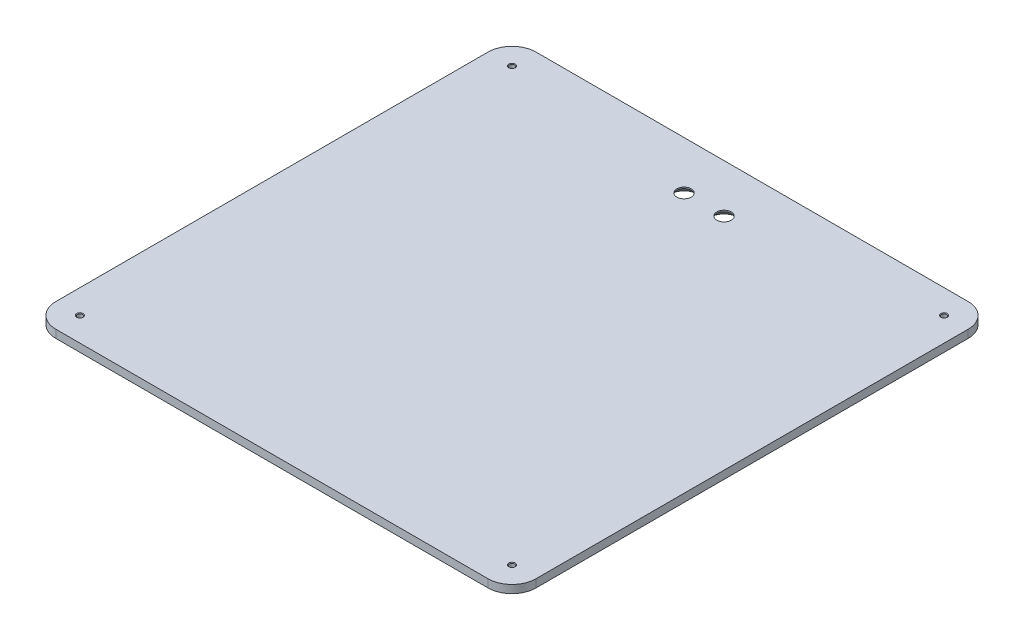
ISO-10303-21;
HEADER;
FILE_DESCRIPTION(('STEP AP214'),'2;1');
FILE_NAME('part.step','',(''),(''),'','','');
FILE_SCHEMA(('AUTOMOTIVE_DESIGN { 1 0 10303 214 1 1 1 1 }'));
ENDSEC;
DATA;
#1=APPLICATION_CONTEXT('core data for automotive mechanical design processes');
#2=APPLICATION_PROTOCOL_DEFINITION('international standard','automotive_design',2000,#1);
#3=PRODUCT_CONTEXT('',#1,'mechanical');
#4=PRODUCT('Part','Part','',(#3));
#5=PRODUCT_RELATED_PRODUCT_CATEGORY('part','',(#4));
#6=PRODUCT_DEFINITION_FORMATION('','',#4);
#7=PRODUCT_DEFINITION_CONTEXT('part definition',#1,'design');
#8=PRODUCT_DEFINITION('design','',#6,#7);
#9=PRODUCT_DEFINITION_SHAPE('','',#8);
#10=(LENGTH_UNIT() NAMED_UNIT(*) SI_UNIT(.MILLI.,.METRE.));
#11=(NAMED_UNIT(*) PLANE_ANGLE_UNIT() SI_UNIT($,.RADIAN.));
#12=(NAMED_UNIT(*) SI_UNIT($,.STERADIAN.) SOLID_ANGLE_UNIT());
#13=UNCERTAINTY_MEASURE_WITH_UNIT(LENGTH_MEASURE(1.E-05),#10,'distance_accuracy_value','');
#14=(GEOMETRIC_REPRESENTATION_CONTEXT(3) GLOBAL_UNCERTAINTY_ASSIGNED_CONTEXT((#13)) GLOBAL_UNIT_ASSIGNED_CONTEXT((#10,
#11,#12)) REPRESENTATION_CONTEXT('',''));
#15=CARTESIAN_POINT('',(0.,0.,0.));
#16=DIRECTION('',(0.,0.,1.));
#17=DIRECTION('',(1.,0.,0.));
#18=AXIS2_PLACEMENT_3D('',#15,#16,#17);
#19=CARTESIAN_POINT('',(-150.,-5.,-150.));
#20=DIRECTION('',(-1.,0.,0.));
#21=DIRECTION('',(0.,0.,1.));
#22=AXIS2_PLACEMENT_3D('',#19,#20,#21);
#23=PLANE('',#22);
#24=DIRECTION('',(0.,0.,1.));
#25=VECTOR('',#24,1.);
#26=CARTESIAN_POINT('',(-150.,-5.,-150.));
#27=LINE('',#26,#25);
#28=CARTESIAN_POINT('',(-150.,-5.,-135.));
#29=VERTEX_POINT('',#28);
#30=CARTESIAN_POINT('',(-150.,-5.,135.));
#31=VERTEX_POINT('',#30);
#32=EDGE_CURVE('E158',#29,#31,#27,.T.);
#33=ORIENTED_EDGE('',*,*,#32,.T.);
#34=DIRECTION('',(0.,1.,0.));
#35=VECTOR('',#34,1.);
#36=CARTESIAN_POINT('',(-150.,-5.,135.));
#37=LINE('',#36,#35);
#38=CARTESIAN_POINT('',(-150.,0.,135.));
#39=VERTEX_POINT('',#38);
#40=EDGE_CURVE('E11',#31,#39,#37,.T.);
#41=ORIENTED_EDGE('',*,*,#40,.T.);
#42=DIRECTION('',(0.,0.,1.));
#43=VECTOR('',#42,1.);
#44=CARTESIAN_POINT('',(-150.,0.,-150.));
#45=LINE('',#44,#43);
#46=CARTESIAN_POINT('',(-150.,0.,-135.));
#47=VERTEX_POINT('',#46);
#48=EDGE_CURVE('E161',#47,#39,#45,.T.);
#49=ORIENTED_EDGE('',*,*,#48,.F.);
#50=DIRECTION('',(0.,1.,0.));
#51=VECTOR('',#50,1.);
#52=CARTESIAN_POINT('',(-150.,-5.,-135.));
#53=LINE('',#52,#51);
#54=EDGE_CURVE('E46',#47,#29,#53,.F.);
#55=ORIENTED_EDGE('',*,*,#54,.T.);
#56=EDGE_LOOP('',(#33,#41,#49,#55));
#57=FACE_BOUND('',#56,.T.);
#58=ADVANCED_FACE('F38',(#57),#23,.T.);
#59=CARTESIAN_POINT('',(150.,-5.,-150.));
#60=DIRECTION('',(0.,0.,-1.));
#61=DIRECTION('',(-1.,0.,0.));
#62=AXIS2_PLACEMENT_3D('',#59,#60,#61);
#63=PLANE('',#62);
#64=DIRECTION('',(-1.,0.,0.));
#65=VECTOR('',#64,1.);
#66=CARTESIAN_POINT('',(150.,0.,-150.));
#67=LINE('',#66,#65);
#68=CARTESIAN_POINT('',(135.,0.,-150.));
#69=VERTEX_POINT('',#68);
#70=CARTESIAN_POINT('',(-135.,0.,-150.));
#71=VERTEX_POINT('',#70);
#72=EDGE_CURVE('E124',#69,#71,#67,.T.);
#73=ORIENTED_EDGE('',*,*,#72,.F.);
#74=DIRECTION('',(0.,1.,0.));
#75=VECTOR('',#74,1.);
#76=CARTESIAN_POINT('',(135.,-5.,-150.));
#77=LINE('',#76,#75);
#78=CARTESIAN_POINT('',(135.,-5.,-150.));
#79=VERTEX_POINT('',#78);
#80=EDGE_CURVE('E142',#69,#79,#77,.F.);
#81=ORIENTED_EDGE('',*,*,#80,.T.);
#82=DIRECTION('',(-1.,0.,0.));
#83=VECTOR('',#82,1.);
#84=CARTESIAN_POINT('',(150.,-5.,-150.));
#85=LINE('',#84,#83);
#86=CARTESIAN_POINT('',(-135.,-5.,-150.));
#87=VERTEX_POINT('',#86);
#88=EDGE_CURVE('E127',#79,#87,#85,.T.);
#89=ORIENTED_EDGE('',*,*,#88,.T.);
#90=DIRECTION('',(0.,1.,0.));
#91=VECTOR('',#90,1.);
#92=CARTESIAN_POINT('',(-135.,-5.,-150.));
#93=LINE('',#92,#91);
#94=EDGE_CURVE('E139',#87,#71,#93,.T.);
#95=ORIENTED_EDGE('',*,*,#94,.T.);
#96=EDGE_LOOP('',(#73,#81,#89,#95));
#97=FACE_BOUND('',#96,.T.);
#98=ADVANCED_FACE('F173',(#97),#63,.T.);
#99=CARTESIAN_POINT('',(150.,-5.,-150.));
#100=DIRECTION('',(1.,0.,0.));
#101=DIRECTION('',(0.,0.,-1.));
#102=AXIS2_PLACEMENT_3D('',#99,#100,#101);
#103=PLANE('',#102);
#104=DIRECTION('',(0.,0.,-1.));
#105=VECTOR('',#104,1.);
#106=CARTESIAN_POINT('',(150.,-5.,-150.));
#107=LINE('',#106,#105);
#108=CARTESIAN_POINT('',(150.,-5.,135.));
#109=VERTEX_POINT('',#108);
#110=CARTESIAN_POINT('',(150.,-5.,-135.));
#111=VERTEX_POINT('',#110);
#112=EDGE_CURVE('E132',#109,#111,#107,.T.);
#113=ORIENTED_EDGE('',*,*,#112,.T.);
#114=DIRECTION('',(0.,1.,0.));
#115=VECTOR('',#114,1.);
#116=CARTESIAN_POINT('',(150.,-5.,-135.));
#117=LINE('',#116,#115);
#118=CARTESIAN_POINT('',(150.,0.,-135.));
#119=VERTEX_POINT('',#118);
#120=EDGE_CURVE('E123',#111,#119,#117,.T.);
#121=ORIENTED_EDGE('',*,*,#120,.T.);
#122=DIRECTION('',(0.,0.,-1.));
#123=VECTOR('',#122,1.);
#124=CARTESIAN_POINT('',(150.,0.,-150.));
#125=LINE('',#124,#123);
#126=CARTESIAN_POINT('',(150.,0.,135.));
#127=VERTEX_POINT('',#126);
#128=EDGE_CURVE('E108',#127,#119,#125,.T.);
#129=ORIENTED_EDGE('',*,*,#128,.F.);
#130=DIRECTION('',(0.,1.,0.));
#131=VECTOR('',#130,1.);
#132=CARTESIAN_POINT('',(150.,-5.,135.));
#133=LINE('',#132,#131);
#134=EDGE_CURVE('E121',#127,#109,#133,.F.);
#135=ORIENTED_EDGE('',*,*,#134,.T.);
#136=EDGE_LOOP('',(#113,#121,#129,#135));
#137=FACE_BOUND('',#136,.T.);
#138=ADVANCED_FACE('F120',(#137),#103,.T.);
#139=CARTESIAN_POINT('',(150.,-5.,150.));
#140=DIRECTION('',(0.,0.,1.));
#141=DIRECTION('',(1.,0.,0.));
#142=AXIS2_PLACEMENT_3D('',#139,#140,#141);
#143=PLANE('',#142);
#144=DIRECTION('',(1.,0.,0.));
#145=VECTOR('',#144,1.);
#146=CARTESIAN_POINT('',(150.,-5.,150.));
#147=LINE('',#146,#145);
#148=CARTESIAN_POINT('',(-135.,-5.,150.));
#149=VERTEX_POINT('',#148);
#150=CARTESIAN_POINT('',(135.,-5.,150.));
#151=VERTEX_POINT('',#150);
#152=EDGE_CURVE('E167',#149,#151,#147,.T.);
#153=ORIENTED_EDGE('',*,*,#152,.T.);
#154=DIRECTION('',(0.,1.,0.));
#155=VECTOR('',#154,1.);
#156=CARTESIAN_POINT('',(135.,-5.,150.));
#157=LINE('',#156,#155);
#158=CARTESIAN_POINT('',(135.,0.,150.));
#159=VERTEX_POINT('',#158);
#160=EDGE_CURVE('E152',#151,#159,#157,.T.);
#161=ORIENTED_EDGE('',*,*,#160,.T.);
#162=DIRECTION('',(1.,0.,0.));
#163=VECTOR('',#162,1.);
#164=CARTESIAN_POINT('',(150.,0.,150.));
#165=LINE('',#164,#163);
#166=CARTESIAN_POINT('',(-135.,0.,150.));
#167=VERTEX_POINT('',#166);
#168=EDGE_CURVE('E109',#167,#159,#165,.T.);
#169=ORIENTED_EDGE('',*,*,#168,.F.);
#170=DIRECTION('',(0.,1.,0.));
#171=VECTOR('',#170,1.);
#172=CARTESIAN_POINT('',(-135.,-5.,150.));
#173=LINE('',#172,#171);
#174=EDGE_CURVE('E60',#167,#149,#173,.F.);
#175=ORIENTED_EDGE('',*,*,#174,.T.);
#176=EDGE_LOOP('',(#153,#161,#169,#175));
#177=FACE_BOUND('',#176,.T.);
#178=ADVANCED_FACE('F270',(#177),#143,.T.);
#179=CARTESIAN_POINT('',(0.,-5.,0.));
#180=DIRECTION('',(0.,-1.,0.));
#181=DIRECTION('',(0.,0.,-1.));
#182=AXIS2_PLACEMENT_3D('',#179,#180,#181);
#183=PLANE('',#182);
#184=CARTESIAN_POINT('',(135.,-5.,135.));
#185=DIRECTION('',(0.,-1.,0.));
#186=DIRECTION('',(0.,0.,-1.));
#187=AXIS2_PLACEMENT_3D('',#184,#185,#186);
#188=CIRCLE('',#187,1.65);
#189=CARTESIAN_POINT('',(135.,-5.,133.35));
#190=VERTEX_POINT('',#189);
#191=EDGE_CURVE('E230',#190,#190,#188,.T.);
#192=ORIENTED_EDGE('',*,*,#191,.F.);
#193=EDGE_LOOP('',(#192));
#194=FACE_BOUND('',#193,.T.);
#195=CARTESIAN_POINT('',(-135.,-5.,135.));
#196=DIRECTION('',(0.,-1.,0.));
#197=DIRECTION('',(0.,0.,-1.));
#198=AXIS2_PLACEMENT_3D('',#195,#196,#197);
#199=CIRCLE('',#198,1.65000000000001);
#200=CARTESIAN_POINT('',(-135.,-5.,133.35));
#201=VERTEX_POINT('',#200);
#202=EDGE_CURVE('E221',#201,#201,#199,.T.);
#203=ORIENTED_EDGE('',*,*,#202,.F.);
#204=EDGE_LOOP('',(#203));
#205=FACE_BOUND('',#204,.T.);
#206=CARTESIAN_POINT('',(-135.,-5.,-135.));
#207=DIRECTION('',(0.,-1.,0.));
#208=DIRECTION('',(0.,0.,-1.));
#209=AXIS2_PLACEMENT_3D('',#206,#207,#208);
#210=CIRCLE('',#209,1.65000000000001);
#211=CARTESIAN_POINT('',(-135.,-5.,-136.65));
#212=VERTEX_POINT('',#211);
#213=EDGE_CURVE('E212',#212,#212,#210,.T.);
#214=ORIENTED_EDGE('',*,*,#213,.F.);
#215=EDGE_LOOP('',(#214));
#216=FACE_BOUND('',#215,.T.);
#217=CARTESIAN_POINT('',(135.,-5.,-135.));
#218=DIRECTION('',(0.,-1.,0.));
#219=DIRECTION('',(0.,0.,-1.));
#220=AXIS2_PLACEMENT_3D('',#217,#218,#219);
#221=CIRCLE('',#220,1.65);
#222=CARTESIAN_POINT('',(135.,-5.,-136.65));
#223=VERTEX_POINT('',#222);
#224=EDGE_CURVE('E203',#223,#223,#221,.T.);
#225=ORIENTED_EDGE('',*,*,#224,.F.);
#226=EDGE_LOOP('',(#225));
#227=FACE_BOUND('',#226,.T.);
#228=CARTESIAN_POINT('',(12.5,-5.,-120.));
#229=DIRECTION('',(0.,-1.,0.));
#230=DIRECTION('',(0.,0.,-1.));
#231=AXIS2_PLACEMENT_3D('',#228,#229,#230);
#232=CIRCLE('',#231,8.65);
#233=CARTESIAN_POINT('',(12.5,-5.,-128.65));
#234=VERTEX_POINT('',#233);
#235=EDGE_CURVE('E200',#234,#234,#232,.T.);
#236=ORIENTED_EDGE('',*,*,#235,.F.);
#237=EDGE_LOOP('',(#236));
#238=FACE_BOUND('',#237,.T.);
#239=CARTESIAN_POINT('',(-12.5,-5.,-120.));
#240=DIRECTION('',(0.,-1.,0.));
#241=DIRECTION('',(0.,0.,-1.));
#242=AXIS2_PLACEMENT_3D('',#239,#240,#241);
#243=CIRCLE('',#242,8.65);
#244=CARTESIAN_POINT('',(-12.5,-5.,-128.65));
#245=VERTEX_POINT('',#244);
#246=EDGE_CURVE('E189',#245,#245,#243,.T.);
#247=ORIENTED_EDGE('',*,*,#246,.F.);
#248=EDGE_LOOP('',(#247));
#249=FACE_BOUND('',#248,.T.);
#250=ORIENTED_EDGE('',*,*,#88,.F.);
#251=CARTESIAN_POINT('',(135.,-5.,-135.));
#252=DIRECTION('',(0.,-1.,0.));
#253=DIRECTION('',(0.,0.,-1.));
#254=AXIS2_PLACEMENT_3D('',#251,#252,#253);
#255=CIRCLE('',#254,15.);
#256=EDGE_CURVE('E149',#79,#111,#255,.T.);
#257=ORIENTED_EDGE('',*,*,#256,.T.);
#258=ORIENTED_EDGE('',*,*,#112,.F.);
#259=CARTESIAN_POINT('',(135.,-5.,135.));
#260=DIRECTION('',(0.,-1.,0.));
#261=DIRECTION('',(0.,0.,-1.));
#262=AXIS2_PLACEMENT_3D('',#259,#260,#261);
#263=CIRCLE('',#262,15.);
#264=EDGE_CURVE('E53',#109,#151,#263,.T.);
#265=ORIENTED_EDGE('',*,*,#264,.T.);
#266=ORIENTED_EDGE('',*,*,#152,.F.);
#267=CARTESIAN_POINT('',(-135.,-5.,135.));
#268=DIRECTION('',(0.,-1.,0.));
#269=DIRECTION('',(0.,0.,-1.));
#270=AXIS2_PLACEMENT_3D('',#267,#268,#269);
#271=CIRCLE('',#270,15.);
#272=EDGE_CURVE('E146',#149,#31,#271,.T.);
#273=ORIENTED_EDGE('',*,*,#272,.T.);
#274=ORIENTED_EDGE('',*,*,#32,.F.);
#275=CARTESIAN_POINT('',(-135.,-5.,-135.));
#276=DIRECTION('',(0.,-1.,0.));
#277=DIRECTION('',(0.,0.,-1.));
#278=AXIS2_PLACEMENT_3D('',#275,#276,#277);
#279=CIRCLE('',#278,15.);
#280=EDGE_CURVE('E144',#29,#87,#279,.T.);
#281=ORIENTED_EDGE('',*,*,#280,.T.);
#282=EDGE_LOOP('',(#250,#257,#258,#265,#266,#273,#274,#281));
#283=FACE_BOUND('',#282,.T.);
#284=ADVANCED_FACE('F165',(#194,#205,#216,#227,#238,#249,#283),#183,.T.);
#285=CARTESIAN_POINT('',(0.,0.,0.));
#286=DIRECTION('',(0.,-1.,0.));
#287=DIRECTION('',(0.,0.,-1.));
#288=AXIS2_PLACEMENT_3D('',#285,#286,#287);
#289=PLANE('',#288);
#290=CARTESIAN_POINT('',(135.,0.,135.));
#291=DIRECTION('',(0.,1.,0.));
#292=DIRECTION('',(0.,0.,1.));
#293=AXIS2_PLACEMENT_3D('',#290,#291,#292);
#294=CIRCLE('',#293,2.025);
#295=CARTESIAN_POINT('',(135.,0.,137.025));
#296=VERTEX_POINT('',#295);
#297=EDGE_CURVE('E236',#296,#296,#294,.T.);
#298=ORIENTED_EDGE('',*,*,#297,.F.);
#299=EDGE_LOOP('',(#298));
#300=FACE_BOUND('',#299,.T.);
#301=CARTESIAN_POINT('',(-135.,0.,135.));
#302=DIRECTION('',(0.,1.,0.));
#303=DIRECTION('',(0.,0.,1.));
#304=AXIS2_PLACEMENT_3D('',#301,#302,#303);
#305=CIRCLE('',#304,2.025);
#306=CARTESIAN_POINT('',(-135.,0.,137.025));
#307=VERTEX_POINT('',#306);
#308=EDGE_CURVE('E227',#307,#307,#305,.T.);
#309=ORIENTED_EDGE('',*,*,#308,.F.);
#310=EDGE_LOOP('',(#309));
#311=FACE_BOUND('',#310,.T.);
#312=CARTESIAN_POINT('',(-135.,0.,-135.));
#313=DIRECTION('',(0.,1.,0.));
#314=DIRECTION('',(0.,0.,1.));
#315=AXIS2_PLACEMENT_3D('',#312,#313,#314);
#316=CIRCLE('',#315,2.025);
#317=CARTESIAN_POINT('',(-135.,0.,-132.975));
#318=VERTEX_POINT('',#317);
#319=EDGE_CURVE('E218',#318,#318,#316,.T.);
#320=ORIENTED_EDGE('',*,*,#319,.F.);
#321=EDGE_LOOP('',(#320));
#322=FACE_BOUND('',#321,.T.);
#323=CARTESIAN_POINT('',(135.,0.,-135.));
#324=DIRECTION('',(0.,1.,0.));
#325=DIRECTION('',(0.,0.,1.));
#326=AXIS2_PLACEMENT_3D('',#323,#324,#325);
#327=CIRCLE('',#326,2.025);
#328=CARTESIAN_POINT('',(135.,0.,-132.975));
#329=VERTEX_POINT('',#328);
#330=EDGE_CURVE('E209',#329,#329,#327,.T.);
#331=ORIENTED_EDGE('',*,*,#330,.F.);
#332=EDGE_LOOP('',(#331));
#333=FACE_BOUND('',#332,.T.);
#334=CARTESIAN_POINT('',(12.5,0.,-120.));
#335=DIRECTION('',(0.,-1.,0.));
#336=DIRECTION('',(0.,0.,-1.));
#337=AXIS2_PLACEMENT_3D('',#334,#335,#336);
#338=CIRCLE('',#337,4.5);
#339=CARTESIAN_POINT('',(12.5,0.,-124.5));
#340=VERTEX_POINT('',#339);
#341=EDGE_CURVE('E194',#340,#340,#338,.T.);
#342=ORIENTED_EDGE('',*,*,#341,.T.);
#343=EDGE_LOOP('',(#342));
#344=FACE_BOUND('',#343,.T.);
#345=CARTESIAN_POINT('',(-12.5,0.,-120.));
#346=DIRECTION('',(0.,-1.,0.));
#347=DIRECTION('',(0.,0.,-1.));
#348=AXIS2_PLACEMENT_3D('',#345,#346,#347);
#349=CIRCLE('',#348,4.49999999999999);
#350=CARTESIAN_POINT('',(-12.5,0.,-124.5));
#351=VERTEX_POINT('',#350);
#352=EDGE_CURVE('E182',#351,#351,#349,.T.);
#353=ORIENTED_EDGE('',*,*,#352,.T.);
#354=EDGE_LOOP('',(#353));
#355=FACE_BOUND('',#354,.T.);
#356=ORIENTED_EDGE('',*,*,#128,.T.);
#357=CARTESIAN_POINT('',(135.,0.,-135.));
#358=DIRECTION('',(0.,-1.,0.));
#359=DIRECTION('',(0.,0.,-1.));
#360=AXIS2_PLACEMENT_3D('',#357,#358,#359);
#361=CIRCLE('',#360,15.);
#362=EDGE_CURVE('E114',#119,#69,#361,.F.);
#363=ORIENTED_EDGE('',*,*,#362,.T.);
#364=ORIENTED_EDGE('',*,*,#72,.T.);
#365=CARTESIAN_POINT('',(-135.,0.,-135.));
#366=DIRECTION('',(0.,-1.,0.));
#367=DIRECTION('',(0.,0.,-1.));
#368=AXIS2_PLACEMENT_3D('',#365,#366,#367);
#369=CIRCLE('',#368,15.);
#370=EDGE_CURVE('E129',#71,#47,#369,.F.);
#371=ORIENTED_EDGE('',*,*,#370,.T.);
#372=ORIENTED_EDGE('',*,*,#48,.T.);
#373=CARTESIAN_POINT('',(-135.,0.,135.));
#374=DIRECTION('',(0.,-1.,0.));
#375=DIRECTION('',(0.,0.,-1.));
#376=AXIS2_PLACEMENT_3D('',#373,#374,#375);
#377=CIRCLE('',#376,15.);
#378=EDGE_CURVE('E115',#39,#167,#377,.F.);
#379=ORIENTED_EDGE('',*,*,#378,.T.);
#380=ORIENTED_EDGE('',*,*,#168,.T.);
#381=CARTESIAN_POINT('',(135.,0.,135.));
#382=DIRECTION('',(0.,-1.,0.));
#383=DIRECTION('',(0.,0.,-1.));
#384=AXIS2_PLACEMENT_3D('',#381,#382,#383);
#385=CIRCLE('',#384,15.);
#386=EDGE_CURVE('E105',#159,#127,#385,.F.);
#387=ORIENTED_EDGE('',*,*,#386,.T.);
#388=EDGE_LOOP('',(#356,#363,#364,#371,#372,#379,#380,#387));
#389=FACE_BOUND('',#388,.T.);
#390=ADVANCED_FACE('F107',(#300,#311,#322,#333,#344,#355,#389),#289,.F.);
#391=CARTESIAN_POINT('',(-12.5,-5.,-120.));
#392=DIRECTION('',(0.,-1.,0.));
#393=DIRECTION('',(0.,0.,-1.));
#394=AXIS2_PLACEMENT_3D('',#391,#392,#393);
#395=CYLINDRICAL_SURFACE('',#394,4.49999999999999);
#396=ORIENTED_EDGE('',*,*,#352,.F.);
#397=EDGE_LOOP('',(#396));
#398=FACE_BOUND('',#397,.T.);
#399=CARTESIAN_POINT('',(-12.5,-0.850000000000013,-120.));
#400=DIRECTION('',(0.,-1.,0.));
#401=DIRECTION('',(0.,0.,-1.));
#402=AXIS2_PLACEMENT_3D('',#399,#400,#401);
#403=CIRCLE('',#402,4.49999999999999);
#404=CARTESIAN_POINT('',(-12.5,-0.850000000000013,-124.5));
#405=VERTEX_POINT('',#404);
#406=EDGE_CURVE('E184',#405,#405,#403,.T.);
#407=ORIENTED_EDGE('',*,*,#406,.T.);
#408=EDGE_LOOP('',(#407));
#409=FACE_BOUND('',#408,.T.);
#410=ADVANCED_FACE('F244',(#398,#409),#395,.F.);
#411=CARTESIAN_POINT('',(-12.5,-5.,-120.));
#412=DIRECTION('',(0.,-1.,0.));
#413=DIRECTION('',(0.,0.,-1.));
#414=AXIS2_PLACEMENT_3D('',#411,#412,#413);
#415=CONICAL_SURFACE('',#414,8.65,0.785398163397451);
#416=ORIENTED_EDGE('',*,*,#406,.F.);
#417=EDGE_LOOP('',(#416));
#418=FACE_BOUND('',#417,.T.);
#419=ORIENTED_EDGE('',*,*,#246,.T.);
#420=EDGE_LOOP('',(#419));
#421=FACE_BOUND('',#420,.T.);
#422=ADVANCED_FACE('F258',(#418,#421),#415,.F.);
#423=CARTESIAN_POINT('',(12.5,-5.,-120.));
#424=DIRECTION('',(0.,-1.,0.));
#425=DIRECTION('',(0.,0.,-1.));
#426=AXIS2_PLACEMENT_3D('',#423,#424,#425);
#427=CYLINDRICAL_SURFACE('',#426,4.5);
#428=ORIENTED_EDGE('',*,*,#341,.F.);
#429=EDGE_LOOP('',(#428));
#430=FACE_BOUND('',#429,.T.);
#431=CARTESIAN_POINT('',(12.5,-0.850000000000013,-120.));
#432=DIRECTION('',(0.,-1.,0.));
#433=DIRECTION('',(0.,0.,-1.));
#434=AXIS2_PLACEMENT_3D('',#431,#432,#433);
#435=CIRCLE('',#434,4.49999999999999);
#436=CARTESIAN_POINT('',(12.5,-0.850000000000013,-124.5));
#437=VERTEX_POINT('',#436);
#438=EDGE_CURVE('E197',#437,#437,#435,.T.);
#439=ORIENTED_EDGE('',*,*,#438,.T.);
#440=EDGE_LOOP('',(#439));
#441=FACE_BOUND('',#440,.T.);
#442=ADVANCED_FACE('F254',(#430,#441),#427,.F.);
#443=CARTESIAN_POINT('',(12.5,-5.,-120.));
#444=DIRECTION('',(0.,-1.,0.));
#445=DIRECTION('',(0.,0.,-1.));
#446=AXIS2_PLACEMENT_3D('',#443,#444,#445);
#447=CONICAL_SURFACE('',#446,8.65,0.785398163397451);
#448=ORIENTED_EDGE('',*,*,#438,.F.);
#449=EDGE_LOOP('',(#448));
#450=FACE_BOUND('',#449,.T.);
#451=ORIENTED_EDGE('',*,*,#235,.T.);
#452=EDGE_LOOP('',(#451));
#453=FACE_BOUND('',#452,.T.);
#454=ADVANCED_FACE('F257',(#450,#453),#447,.F.);
#455=CARTESIAN_POINT('',(135.,0.,-135.));
#456=DIRECTION('',(0.,1.,0.));
#457=DIRECTION('',(0.,0.,1.));
#458=AXIS2_PLACEMENT_3D('',#455,#456,#457);
#459=CYLINDRICAL_SURFACE('',#458,1.65);
#460=CARTESIAN_POINT('',(135.,-0.375000000000001,-135.));
#461=DIRECTION('',(0.,1.,0.));
#462=DIRECTION('',(0.,0.,1.));
#463=AXIS2_PLACEMENT_3D('',#460,#461,#462);
#464=CIRCLE('',#463,1.65000000000001);
#465=CARTESIAN_POINT('',(135.,-0.375000000000001,-133.35));
#466=VERTEX_POINT('',#465);
#467=EDGE_CURVE('E206',#466,#466,#464,.T.);
#468=ORIENTED_EDGE('',*,*,#467,.T.);
#469=EDGE_LOOP('',(#468));
#470=FACE_BOUND('',#469,.T.);
#471=ORIENTED_EDGE('',*,*,#224,.T.);
#472=EDGE_LOOP('',(#471));
#473=FACE_BOUND('',#472,.T.);
#474=ADVANCED_FACE('F264',(#470,#473),#459,.F.);
#475=CARTESIAN_POINT('',(135.,0.,-135.));
#476=DIRECTION('',(0.,1.,0.));
#477=DIRECTION('',(0.,0.,1.));
#478=AXIS2_PLACEMENT_3D('',#475,#476,#477);
#479=CONICAL_SURFACE('',#478,2.025,0.785398163397428);
#480=ORIENTED_EDGE('',*,*,#467,.F.);
#481=EDGE_LOOP('',(#480));
#482=FACE_BOUND('',#481,.T.);
#483=ORIENTED_EDGE('',*,*,#330,.T.);
#484=EDGE_LOOP('',(#483));
#485=FACE_BOUND('',#484,.T.);
#486=ADVANCED_FACE('F382',(#482,#485),#479,.F.);
#487=CARTESIAN_POINT('',(-135.,0.,-135.));
#488=DIRECTION('',(0.,1.,0.));
#489=DIRECTION('',(0.,0.,1.));
#490=AXIS2_PLACEMENT_3D('',#487,#488,#489);
#491=CYLINDRICAL_SURFACE('',#490,1.65000000000001);
#492=CARTESIAN_POINT('',(-135.,-0.375000000000001,-135.));
#493=DIRECTION('',(0.,1.,0.));
#494=DIRECTION('',(0.,0.,1.));
#495=AXIS2_PLACEMENT_3D('',#492,#493,#494);
#496=CIRCLE('',#495,1.65000000000001);
#497=CARTESIAN_POINT('',(-135.,-0.375000000000001,-133.35));
#498=VERTEX_POINT('',#497);
#499=EDGE_CURVE('E215',#498,#498,#496,.T.);
#500=ORIENTED_EDGE('',*,*,#499,.T.);
#501=EDGE_LOOP('',(#500));
#502=FACE_BOUND('',#501,.T.);
#503=ORIENTED_EDGE('',*,*,#213,.T.);
#504=EDGE_LOOP('',(#503));
#505=FACE_BOUND('',#504,.T.);
#506=ADVANCED_FACE('F372',(#502,#505),#491,.F.);
#507=CARTESIAN_POINT('',(-135.,0.,-135.));
#508=DIRECTION('',(0.,1.,0.));
#509=DIRECTION('',(0.,0.,1.));
#510=AXIS2_PLACEMENT_3D('',#507,#508,#509);
#511=CONICAL_SURFACE('',#510,2.025,0.785398163397428);
#512=ORIENTED_EDGE('',*,*,#499,.F.);
#513=EDGE_LOOP('',(#512));
#514=FACE_BOUND('',#513,.T.);
#515=ORIENTED_EDGE('',*,*,#319,.T.);
#516=EDGE_LOOP('',(#515));
#517=FACE_BOUND('',#516,.T.);
#518=ADVANCED_FACE('F361',(#514,#517),#511,.F.);
#519=CARTESIAN_POINT('',(-135.,0.,135.));
#520=DIRECTION('',(0.,1.,0.));
#521=DIRECTION('',(0.,0.,1.));
#522=AXIS2_PLACEMENT_3D('',#519,#520,#521);
#523=CYLINDRICAL_SURFACE('',#522,1.65000000000001);
#524=CARTESIAN_POINT('',(-135.,-0.375000000000001,135.));
#525=DIRECTION('',(0.,1.,0.));
#526=DIRECTION('',(0.,0.,1.));
#527=AXIS2_PLACEMENT_3D('',#524,#525,#526);
#528=CIRCLE('',#527,1.65000000000001);
#529=CARTESIAN_POINT('',(-135.,-0.375000000000001,136.65));
#530=VERTEX_POINT('',#529);
#531=EDGE_CURVE('E224',#530,#530,#528,.T.);
#532=ORIENTED_EDGE('',*,*,#531,.T.);
#533=EDGE_LOOP('',(#532));
#534=FACE_BOUND('',#533,.T.);
#535=ORIENTED_EDGE('',*,*,#202,.T.);
#536=EDGE_LOOP('',(#535));
#537=FACE_BOUND('',#536,.T.);
#538=ADVANCED_FACE('F351',(#534,#537),#523,.F.);
#539=CARTESIAN_POINT('',(-135.,0.,135.));
#540=DIRECTION('',(0.,1.,0.));
#541=DIRECTION('',(0.,0.,1.));
#542=AXIS2_PLACEMENT_3D('',#539,#540,#541);
#543=CONICAL_SURFACE('',#542,2.025,0.785398163397428);
#544=ORIENTED_EDGE('',*,*,#531,.F.);
#545=EDGE_LOOP('',(#544));
#546=FACE_BOUND('',#545,.T.);
#547=ORIENTED_EDGE('',*,*,#308,.T.);
#548=EDGE_LOOP('',(#547));
#549=FACE_BOUND('',#548,.T.);
#550=ADVANCED_FACE('F339',(#546,#549),#543,.F.);
#551=CARTESIAN_POINT('',(135.,0.,135.));
#552=DIRECTION('',(0.,1.,0.));
#553=DIRECTION('',(0.,0.,1.));
#554=AXIS2_PLACEMENT_3D('',#551,#552,#553);
#555=CYLINDRICAL_SURFACE('',#554,1.65);
#556=CARTESIAN_POINT('',(135.,-0.375000000000001,135.));
#557=DIRECTION('',(0.,1.,0.));
#558=DIRECTION('',(0.,0.,1.));
#559=AXIS2_PLACEMENT_3D('',#556,#557,#558);
#560=CIRCLE('',#559,1.65000000000001);
#561=CARTESIAN_POINT('',(135.,-0.375000000000001,136.65));
#562=VERTEX_POINT('',#561);
#563=EDGE_CURVE('E233',#562,#562,#560,.T.);
#564=ORIENTED_EDGE('',*,*,#563,.T.);
#565=EDGE_LOOP('',(#564));
#566=FACE_BOUND('',#565,.T.);
#567=ORIENTED_EDGE('',*,*,#191,.T.);
#568=EDGE_LOOP('',(#567));
#569=FACE_BOUND('',#568,.T.);
#570=ADVANCED_FACE('F327',(#566,#569),#555,.F.);
#571=CARTESIAN_POINT('',(135.,0.,135.));
#572=DIRECTION('',(0.,1.,0.));
#573=DIRECTION('',(0.,0.,1.));
#574=AXIS2_PLACEMENT_3D('',#571,#572,#573);
#575=CONICAL_SURFACE('',#574,2.025,0.785398163397428);
#576=ORIENTED_EDGE('',*,*,#563,.F.);
#577=EDGE_LOOP('',(#576));
#578=FACE_BOUND('',#577,.T.);
#579=ORIENTED_EDGE('',*,*,#297,.T.);
#580=EDGE_LOOP('',(#579));
#581=FACE_BOUND('',#580,.T.);
#582=ADVANCED_FACE('F240',(#578,#581),#575,.F.);
#583=CARTESIAN_POINT('',(135.,-5.,-135.));
#584=DIRECTION('',(0.,1.,0.));
#585=DIRECTION('',(0.,0.,1.));
#586=AXIS2_PLACEMENT_3D('',#583,#584,#585);
#587=CYLINDRICAL_SURFACE('',#586,15.);
#588=ORIENTED_EDGE('',*,*,#256,.F.);
#589=ORIENTED_EDGE('',*,*,#80,.F.);
#590=ORIENTED_EDGE('',*,*,#362,.F.);
#591=ORIENTED_EDGE('',*,*,#120,.F.);
#592=EDGE_LOOP('',(#588,#589,#590,#591));
#593=FACE_BOUND('',#592,.T.);
#594=ADVANCED_FACE('F177',(#593),#587,.T.);
#595=CARTESIAN_POINT('',(135.,-5.,135.));
#596=DIRECTION('',(0.,1.,0.));
#597=DIRECTION('',(0.,0.,1.));
#598=AXIS2_PLACEMENT_3D('',#595,#596,#597);
#599=CYLINDRICAL_SURFACE('',#598,15.);
#600=ORIENTED_EDGE('',*,*,#264,.F.);
#601=ORIENTED_EDGE('',*,*,#134,.F.);
#602=ORIENTED_EDGE('',*,*,#386,.F.);
#603=ORIENTED_EDGE('',*,*,#160,.F.);
#604=EDGE_LOOP('',(#600,#601,#602,#603));
#605=FACE_BOUND('',#604,.T.);
#606=ADVANCED_FACE('F126',(#605),#599,.T.);
#607=CARTESIAN_POINT('',(-135.,-5.,135.));
#608=DIRECTION('',(0.,1.,0.));
#609=DIRECTION('',(0.,0.,1.));
#610=AXIS2_PLACEMENT_3D('',#607,#608,#609);
#611=CYLINDRICAL_SURFACE('',#610,15.);
#612=ORIENTED_EDGE('',*,*,#272,.F.);
#613=ORIENTED_EDGE('',*,*,#174,.F.);
#614=ORIENTED_EDGE('',*,*,#378,.F.);
#615=ORIENTED_EDGE('',*,*,#40,.F.);
#616=EDGE_LOOP('',(#612,#613,#614,#615));
#617=FACE_BOUND('',#616,.T.);
#618=ADVANCED_FACE('F296',(#617),#611,.T.);
#619=CARTESIAN_POINT('',(-135.,-5.,-135.));
#620=DIRECTION('',(0.,1.,0.));
#621=DIRECTION('',(0.,0.,1.));
#622=AXIS2_PLACEMENT_3D('',#619,#620,#621);
#623=CYLINDRICAL_SURFACE('',#622,15.);
#624=ORIENTED_EDGE('',*,*,#280,.F.);
#625=ORIENTED_EDGE('',*,*,#54,.F.);
#626=ORIENTED_EDGE('',*,*,#370,.F.);
#627=ORIENTED_EDGE('',*,*,#94,.F.);
#628=EDGE_LOOP('',(#624,#625,#626,#627));
#629=FACE_BOUND('',#628,.T.);
#630=ADVANCED_FACE('F40',(#629),#623,.T.);
#631=CLOSED_SHELL('',(#58,#98,#138,#178,#284,#390,#410,#422,#442,#454,#474,#486,#506,#518,#538,
#550,#570,#582,#594,#606,#618,#630));
#632=MANIFOLD_SOLID_BREP('B2',#631);
#633=ADVANCED_BREP_SHAPE_REPRESENTATION('',(#18,#632),#14);
#634=SHAPE_DEFINITION_REPRESENTATION(#9,#633);
ENDSEC;
END-ISO-10303-21;
